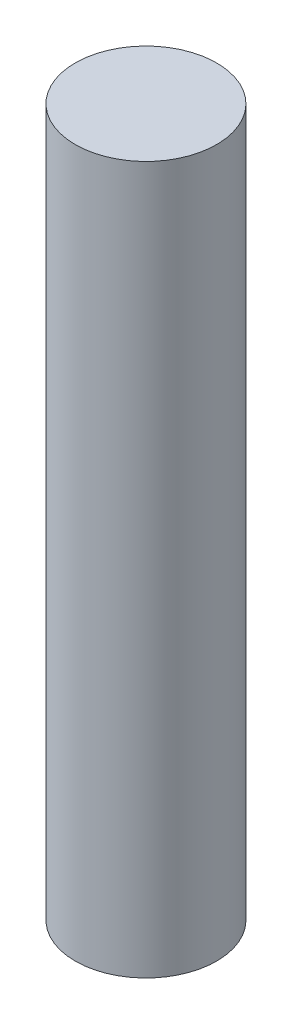
ISO-10303-21;
HEADER;
FILE_DESCRIPTION(('STEP AP214'),'2;1');
FILE_NAME('part.step','',(''),(''),'','','');
FILE_SCHEMA(('AUTOMOTIVE_DESIGN { 1 0 10303 214 1 1 1 1 }'));
ENDSEC;
DATA;
#1=APPLICATION_CONTEXT('core data for automotive mechanical design processes');
#2=APPLICATION_PROTOCOL_DEFINITION('international standard','automotive_design',2000,#1);
#3=PRODUCT_CONTEXT('',#1,'mechanical');
#4=PRODUCT('Part','Part','',(#3));
#5=PRODUCT_RELATED_PRODUCT_CATEGORY('part','',(#4));
#6=PRODUCT_DEFINITION_FORMATION('','',#4);
#7=PRODUCT_DEFINITION_CONTEXT('part definition',#1,'design');
#8=PRODUCT_DEFINITION('design','',#6,#7);
#9=PRODUCT_DEFINITION_SHAPE('','',#8);
#10=(LENGTH_UNIT() NAMED_UNIT(*) SI_UNIT(.MILLI.,.METRE.));
#11=(NAMED_UNIT(*) PLANE_ANGLE_UNIT() SI_UNIT($,.RADIAN.));
#12=(NAMED_UNIT(*) SI_UNIT($,.STERADIAN.) SOLID_ANGLE_UNIT());
#13=UNCERTAINTY_MEASURE_WITH_UNIT(LENGTH_MEASURE(1.E-05),#10,'distance_accuracy_value','');
#14=(GEOMETRIC_REPRESENTATION_CONTEXT(3) GLOBAL_UNCERTAINTY_ASSIGNED_CONTEXT((#13)) GLOBAL_UNIT_ASSIGNED_CONTEXT((#10,
#11,#12)) REPRESENTATION_CONTEXT('',''));
#15=CARTESIAN_POINT('',(0.,0.,0.));
#16=DIRECTION('',(0.,0.,1.));
#17=DIRECTION('',(1.,0.,0.));
#18=AXIS2_PLACEMENT_3D('',#15,#16,#17);
#19=CARTESIAN_POINT('',(0.,10.,0.));
#20=DIRECTION('',(0.,-1.,0.));
#21=DIRECTION('',(0.,0.,-1.));
#22=AXIS2_PLACEMENT_3D('',#19,#20,#21);
#23=CYLINDRICAL_SURFACE('',#22,1.);
#24=CARTESIAN_POINT('',(0.,10.,0.));
#25=DIRECTION('',(0.,1.,0.));
#26=DIRECTION('',(0.,0.,1.));
#27=AXIS2_PLACEMENT_3D('',#24,#25,#26);
#28=CIRCLE('',#27,1.);
#29=CARTESIAN_POINT('',(0.,10.,1.));
#30=VERTEX_POINT('',#29);
#31=EDGE_CURVE('E10',#30,#30,#28,.T.);
#32=ORIENTED_EDGE('',*,*,#31,.F.);
#33=EDGE_LOOP('',(#32));
#34=FACE_BOUND('',#33,.T.);
#35=CARTESIAN_POINT('',(0.,0.,0.));
#36=DIRECTION('',(0.,1.,0.));
#37=DIRECTION('',(0.,0.,1.));
#38=AXIS2_PLACEMENT_3D('',#35,#36,#37);
#39=CIRCLE('',#38,1.);
#40=CARTESIAN_POINT('',(0.,0.,1.));
#41=VERTEX_POINT('',#40);
#42=EDGE_CURVE('E42',#41,#41,#39,.T.);
#43=ORIENTED_EDGE('',*,*,#42,.T.);
#44=EDGE_LOOP('',(#43));
#45=FACE_BOUND('',#44,.T.);
#46=ADVANCED_FACE('F39',(#34,#45),#23,.T.);
#47=CARTESIAN_POINT('',(0.,10.,0.));
#48=DIRECTION('',(0.,1.,0.));
#49=DIRECTION('',(0.,0.,1.));
#50=AXIS2_PLACEMENT_3D('',#47,#48,#49);
#51=PLANE('',#50);
#52=ORIENTED_EDGE('',*,*,#31,.T.);
#53=EDGE_LOOP('',(#52));
#54=FACE_BOUND('',#53,.T.);
#55=ADVANCED_FACE('F56',(#54),#51,.T.);
#56=CARTESIAN_POINT('',(0.,0.,0.));
#57=DIRECTION('',(0.,1.,0.));
#58=DIRECTION('',(0.,0.,1.));
#59=AXIS2_PLACEMENT_3D('',#56,#57,#58);
#60=PLANE('',#59);
#61=ORIENTED_EDGE('',*,*,#42,.F.);
#62=EDGE_LOOP('',(#61));
#63=FACE_BOUND('',#62,.T.);
#64=ADVANCED_FACE('F54',(#63),#60,.F.);
#65=CLOSED_SHELL('',(#46,#55,#64));
#66=MANIFOLD_SOLID_BREP('B2',#65);
#67=ADVANCED_BREP_SHAPE_REPRESENTATION('',(#18,#66),#14);
#68=SHAPE_DEFINITION_REPRESENTATION(#9,#67);
ENDSEC;
END-ISO-10303-21;
